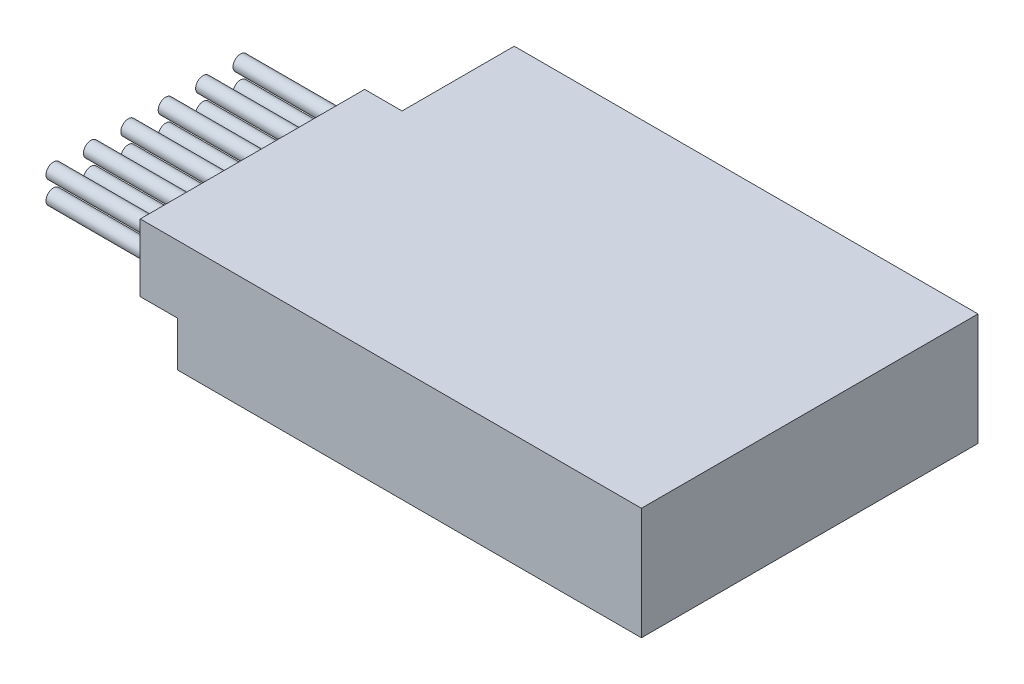
ISO-10303-21;
HEADER;
FILE_DESCRIPTION(('STEP AP214'),'2;1');
FILE_NAME('part.step','',(''),(''),'','','');
FILE_SCHEMA(('AUTOMOTIVE_DESIGN { 1 0 10303 214 1 1 1 1 }'));
ENDSEC;
DATA;
#1=APPLICATION_CONTEXT('core data for automotive mechanical design processes');
#2=APPLICATION_PROTOCOL_DEFINITION('international standard','automotive_design',2000,#1);
#3=PRODUCT_CONTEXT('',#1,'mechanical');
#4=PRODUCT('Part','Part','',(#3));
#5=PRODUCT_RELATED_PRODUCT_CATEGORY('part','',(#4));
#6=PRODUCT_DEFINITION_FORMATION('','',#4);
#7=PRODUCT_DEFINITION_CONTEXT('part definition',#1,'design');
#8=PRODUCT_DEFINITION('design','',#6,#7);
#9=PRODUCT_DEFINITION_SHAPE('','',#8);
#10=(LENGTH_UNIT() NAMED_UNIT(*) SI_UNIT(.MILLI.,.METRE.));
#11=(NAMED_UNIT(*) PLANE_ANGLE_UNIT() SI_UNIT($,.RADIAN.));
#12=(NAMED_UNIT(*) SI_UNIT($,.STERADIAN.) SOLID_ANGLE_UNIT());
#13=UNCERTAINTY_MEASURE_WITH_UNIT(LENGTH_MEASURE(1.E-05),#10,'distance_accuracy_value','');
#14=(GEOMETRIC_REPRESENTATION_CONTEXT(3) GLOBAL_UNCERTAINTY_ASSIGNED_CONTEXT((#13)) GLOBAL_UNIT_ASSIGNED_CONTEXT((#10,
#11,#12)) REPRESENTATION_CONTEXT('',''));
#15=CARTESIAN_POINT('',(0.,0.,0.));
#16=DIRECTION('',(0.,0.,1.));
#17=DIRECTION('',(1.,0.,0.));
#18=AXIS2_PLACEMENT_3D('',#15,#16,#17);
#19=CARTESIAN_POINT('',(-15.5,7.5,-11.25));
#20=DIRECTION('',(1.,0.,0.));
#21=DIRECTION('',(0.,0.,-1.));
#22=AXIS2_PLACEMENT_3D('',#19,#20,#21);
#23=PLANE('',#22);
#24=DIRECTION('',(0.,0.,1.));
#25=VECTOR('',#24,1.);
#26=CARTESIAN_POINT('',(-15.5,3.,11.25));
#27=LINE('',#26,#25);
#28=CARTESIAN_POINT('',(-15.5,3.,-3.75));
#29=VERTEX_POINT('',#28);
#30=CARTESIAN_POINT('',(-15.5,3.,11.25));
#31=VERTEX_POINT('',#30);
#32=EDGE_CURVE('E116',#29,#31,#27,.T.);
#33=ORIENTED_EDGE('',*,*,#32,.F.);
#34=DIRECTION('',(0.,-1.,0.));
#35=VECTOR('',#34,1.);
#36=CARTESIAN_POINT('',(-15.5,7.5,-3.75));
#37=LINE('',#36,#35);
#38=CARTESIAN_POINT('',(-15.5,7.5,-3.75));
#39=VERTEX_POINT('',#38);
#40=EDGE_CURVE('E46',#39,#29,#37,.T.);
#41=ORIENTED_EDGE('',*,*,#40,.F.);
#42=DIRECTION('',(0.,0.,1.));
#43=VECTOR('',#42,1.);
#44=CARTESIAN_POINT('',(-15.5,7.5,-11.25));
#45=LINE('',#44,#43);
#46=CARTESIAN_POINT('',(-15.5,7.5,-11.25));
#47=VERTEX_POINT('',#46);
#48=EDGE_CURVE('E101',#47,#39,#45,.T.);
#49=ORIENTED_EDGE('',*,*,#48,.F.);
#50=DIRECTION('',(0.,-1.,0.));
#51=VECTOR('',#50,1.);
#52=CARTESIAN_POINT('',(-15.5,7.5,-11.25));
#53=LINE('',#52,#51);
#54=CARTESIAN_POINT('',(-15.5,0.,-11.25));
#55=VERTEX_POINT('',#54);
#56=EDGE_CURVE('E232',#47,#55,#53,.T.);
#57=ORIENTED_EDGE('',*,*,#56,.T.);
#58=DIRECTION('',(0.,0.,1.));
#59=VECTOR('',#58,1.);
#60=CARTESIAN_POINT('',(-15.5,0.,-11.25));
#61=LINE('',#60,#59);
#62=CARTESIAN_POINT('',(-15.5,0.,11.25));
#63=VERTEX_POINT('',#62);
#64=EDGE_CURVE('E219',#55,#63,#61,.T.);
#65=ORIENTED_EDGE('',*,*,#64,.T.);
#66=DIRECTION('',(0.,-1.,0.));
#67=VECTOR('',#66,1.);
#68=CARTESIAN_POINT('',(-15.5,7.5,11.25));
#69=LINE('',#68,#67);
#70=EDGE_CURVE('E52',#31,#63,#69,.T.);
#71=ORIENTED_EDGE('',*,*,#70,.F.);
#72=EDGE_LOOP('',(#33,#41,#49,#57,#65,#71));
#73=FACE_BOUND('',#72,.T.);
#74=ADVANCED_FACE('F32',(#73),#23,.F.);
#75=CARTESIAN_POINT('',(15.5,7.5,11.25));
#76=DIRECTION('',(0.,0.,-1.));
#77=DIRECTION('',(-1.,0.,0.));
#78=AXIS2_PLACEMENT_3D('',#75,#76,#77);
#79=PLANE('',#78);
#80=DIRECTION('',(1.,0.,0.));
#81=VECTOR('',#80,1.);
#82=CARTESIAN_POINT('',(15.5,0.,11.25));
#83=LINE('',#82,#81);
#84=CARTESIAN_POINT('',(15.5,0.,11.25));
#85=VERTEX_POINT('',#84);
#86=EDGE_CURVE('E220',#63,#85,#83,.T.);
#87=ORIENTED_EDGE('',*,*,#86,.T.);
#88=DIRECTION('',(0.,-1.,0.));
#89=VECTOR('',#88,1.);
#90=CARTESIAN_POINT('',(15.5,7.5,11.25));
#91=LINE('',#90,#89);
#92=CARTESIAN_POINT('',(15.5,7.5,11.25));
#93=VERTEX_POINT('',#92);
#94=EDGE_CURVE('E97',#93,#85,#91,.T.);
#95=ORIENTED_EDGE('',*,*,#94,.F.);
#96=DIRECTION('',(1.,0.,0.));
#97=VECTOR('',#96,1.);
#98=CARTESIAN_POINT('',(15.5,7.5,11.25));
#99=LINE('',#98,#97);
#100=CARTESIAN_POINT('',(-18.,7.5,11.25));
#101=VERTEX_POINT('',#100);
#102=EDGE_CURVE('E90',#101,#93,#99,.T.);
#103=ORIENTED_EDGE('',*,*,#102,.F.);
#104=DIRECTION('',(0.,1.,0.));
#105=VECTOR('',#104,1.);
#106=CARTESIAN_POINT('',(-18.,7.5,11.25));
#107=LINE('',#106,#105);
#108=CARTESIAN_POINT('',(-18.,3.,11.25));
#109=VERTEX_POINT('',#108);
#110=EDGE_CURVE('E95',#109,#101,#107,.T.);
#111=ORIENTED_EDGE('',*,*,#110,.F.);
#112=DIRECTION('',(1.,0.,0.));
#113=VECTOR('',#112,1.);
#114=CARTESIAN_POINT('',(-18.,3.,11.25));
#115=LINE('',#114,#113);
#116=EDGE_CURVE('E125',#109,#31,#115,.T.);
#117=ORIENTED_EDGE('',*,*,#116,.T.);
#118=ORIENTED_EDGE('',*,*,#70,.T.);
#119=EDGE_LOOP('',(#87,#95,#103,#111,#117,#118));
#120=FACE_BOUND('',#119,.T.);
#121=ADVANCED_FACE('F92',(#120),#79,.F.);
#122=CARTESIAN_POINT('',(15.5,7.5,-11.25));
#123=DIRECTION('',(-1.,0.,0.));
#124=DIRECTION('',(0.,0.,1.));
#125=AXIS2_PLACEMENT_3D('',#122,#123,#124);
#126=PLANE('',#125);
#127=DIRECTION('',(0.,0.,-1.));
#128=VECTOR('',#127,1.);
#129=CARTESIAN_POINT('',(15.5,0.,-11.25));
#130=LINE('',#129,#128);
#131=CARTESIAN_POINT('',(15.5,0.,-11.25));
#132=VERTEX_POINT('',#131);
#133=EDGE_CURVE('E235',#85,#132,#130,.T.);
#134=ORIENTED_EDGE('',*,*,#133,.T.);
#135=DIRECTION('',(0.,-1.,0.));
#136=VECTOR('',#135,1.);
#137=CARTESIAN_POINT('',(15.5,7.5,-11.25));
#138=LINE('',#137,#136);
#139=CARTESIAN_POINT('',(15.5,7.5,-11.25));
#140=VERTEX_POINT('',#139);
#141=EDGE_CURVE('E240',#140,#132,#138,.T.);
#142=ORIENTED_EDGE('',*,*,#141,.F.);
#143=DIRECTION('',(0.,0.,-1.));
#144=VECTOR('',#143,1.);
#145=CARTESIAN_POINT('',(15.5,7.5,-11.25));
#146=LINE('',#145,#144);
#147=EDGE_CURVE('E100',#93,#140,#146,.T.);
#148=ORIENTED_EDGE('',*,*,#147,.F.);
#149=ORIENTED_EDGE('',*,*,#94,.T.);
#150=EDGE_LOOP('',(#134,#142,#148,#149));
#151=FACE_BOUND('',#150,.T.);
#152=ADVANCED_FACE('F212',(#151),#126,.F.);
#153=CARTESIAN_POINT('',(15.5,7.5,-11.25));
#154=DIRECTION('',(0.,0.,1.));
#155=DIRECTION('',(1.,0.,0.));
#156=AXIS2_PLACEMENT_3D('',#153,#154,#155);
#157=PLANE('',#156);
#158=DIRECTION('',(-1.,0.,0.));
#159=VECTOR('',#158,1.);
#160=CARTESIAN_POINT('',(15.5,0.,-11.25));
#161=LINE('',#160,#159);
#162=EDGE_CURVE('E226',#132,#55,#161,.T.);
#163=ORIENTED_EDGE('',*,*,#162,.T.);
#164=ORIENTED_EDGE('',*,*,#56,.F.);
#165=DIRECTION('',(-1.,0.,0.));
#166=VECTOR('',#165,1.);
#167=CARTESIAN_POINT('',(15.5,7.5,-11.25));
#168=LINE('',#167,#166);
#169=EDGE_CURVE('E231',#140,#47,#168,.T.);
#170=ORIENTED_EDGE('',*,*,#169,.F.);
#171=ORIENTED_EDGE('',*,*,#141,.T.);
#172=EDGE_LOOP('',(#163,#164,#170,#171));
#173=FACE_BOUND('',#172,.T.);
#174=ADVANCED_FACE('F254',(#173),#157,.F.);
#175=CARTESIAN_POINT('',(0.,7.5,0.));
#176=DIRECTION('',(0.,-1.,0.));
#177=DIRECTION('',(0.,0.,-1.));
#178=AXIS2_PLACEMENT_3D('',#175,#176,#177);
#179=PLANE('',#178);
#180=ORIENTED_EDGE('',*,*,#48,.T.);
#181=DIRECTION('',(1.,0.,0.));
#182=VECTOR('',#181,1.);
#183=CARTESIAN_POINT('',(-18.,7.5,-3.75));
#184=LINE('',#183,#182);
#185=CARTESIAN_POINT('',(-18.,7.5,-3.75));
#186=VERTEX_POINT('',#185);
#187=EDGE_CURVE('E107',#186,#39,#184,.T.);
#188=ORIENTED_EDGE('',*,*,#187,.F.);
#189=DIRECTION('',(0.,0.,-1.));
#190=VECTOR('',#189,1.);
#191=CARTESIAN_POINT('',(-18.,7.5,11.25));
#192=LINE('',#191,#190);
#193=EDGE_CURVE('E104',#101,#186,#192,.T.);
#194=ORIENTED_EDGE('',*,*,#193,.F.);
#195=ORIENTED_EDGE('',*,*,#102,.T.);
#196=ORIENTED_EDGE('',*,*,#147,.T.);
#197=ORIENTED_EDGE('',*,*,#169,.T.);
#198=EDGE_LOOP('',(#180,#188,#194,#195,#196,#197));
#199=FACE_BOUND('',#198,.T.);
#200=ADVANCED_FACE('F105',(#199),#179,.F.);
#201=CARTESIAN_POINT('',(0.,0.,0.));
#202=DIRECTION('',(0.,-1.,0.));
#203=DIRECTION('',(0.,0.,-1.));
#204=AXIS2_PLACEMENT_3D('',#201,#202,#203);
#205=PLANE('',#204);
#206=ORIENTED_EDGE('',*,*,#64,.F.);
#207=ORIENTED_EDGE('',*,*,#162,.F.);
#208=ORIENTED_EDGE('',*,*,#133,.F.);
#209=ORIENTED_EDGE('',*,*,#86,.F.);
#210=EDGE_LOOP('',(#206,#207,#208,#209));
#211=FACE_BOUND('',#210,.T.);
#212=ADVANCED_FACE('F249',(#211),#205,.T.);
#213=CARTESIAN_POINT('',(-18.,7.5,-3.75));
#214=DIRECTION('',(0.,0.,1.));
#215=DIRECTION('',(0.,-1.,0.));
#216=AXIS2_PLACEMENT_3D('',#213,#214,#215);
#217=PLANE('',#216);
#218=ORIENTED_EDGE('',*,*,#40,.T.);
#219=DIRECTION('',(1.,0.,0.));
#220=VECTOR('',#219,1.);
#221=CARTESIAN_POINT('',(-18.,3.,-3.75));
#222=LINE('',#221,#220);
#223=CARTESIAN_POINT('',(-18.,3.,-3.75));
#224=VERTEX_POINT('',#223);
#225=EDGE_CURVE('E128',#224,#29,#222,.T.);
#226=ORIENTED_EDGE('',*,*,#225,.F.);
#227=DIRECTION('',(0.,-1.,0.));
#228=VECTOR('',#227,1.);
#229=CARTESIAN_POINT('',(-18.,7.5,-3.75));
#230=LINE('',#229,#228);
#231=EDGE_CURVE('E110',#186,#224,#230,.T.);
#232=ORIENTED_EDGE('',*,*,#231,.F.);
#233=ORIENTED_EDGE('',*,*,#187,.T.);
#234=EDGE_LOOP('',(#218,#226,#232,#233));
#235=FACE_BOUND('',#234,.T.);
#236=ADVANCED_FACE('F217',(#235),#217,.F.);
#237=CARTESIAN_POINT('',(-18.,3.,11.25));
#238=DIRECTION('',(0.,1.,0.));
#239=DIRECTION('',(0.,0.,1.));
#240=AXIS2_PLACEMENT_3D('',#237,#238,#239);
#241=PLANE('',#240);
#242=ORIENTED_EDGE('',*,*,#32,.T.);
#243=ORIENTED_EDGE('',*,*,#116,.F.);
#244=DIRECTION('',(0.,0.,1.));
#245=VECTOR('',#244,1.);
#246=CARTESIAN_POINT('',(-18.,3.,11.25));
#247=LINE('',#246,#245);
#248=EDGE_CURVE('E114',#224,#109,#247,.T.);
#249=ORIENTED_EDGE('',*,*,#248,.F.);
#250=ORIENTED_EDGE('',*,*,#225,.T.);
#251=EDGE_LOOP('',(#242,#243,#249,#250));
#252=FACE_BOUND('',#251,.T.);
#253=ADVANCED_FACE('F174',(#252),#241,.F.);
#254=CARTESIAN_POINT('',(-18.,0.,0.));
#255=DIRECTION('',(1.,0.,0.));
#256=DIRECTION('',(0.,0.,-1.));
#257=AXIS2_PLACEMENT_3D('',#254,#255,#256);
#258=PLANE('',#257);
#259=CARTESIAN_POINT('',(-18.,4.7,10.05));
#260=DIRECTION('',(1.,0.,0.));
#261=DIRECTION('',(0.,0.,-1.));
#262=AXIS2_PLACEMENT_3D('',#259,#260,#261);
#263=CIRCLE('',#262,0.500000000000001);
#264=CARTESIAN_POINT('',(-18.,4.7,9.55000000000001));
#265=VERTEX_POINT('',#264);
#266=EDGE_CURVE('E11',#265,#265,#263,.F.);
#267=ORIENTED_EDGE('',*,*,#266,.F.);
#268=EDGE_LOOP('',(#267));
#269=FACE_BOUND('',#268,.T.);
#270=CARTESIAN_POINT('',(-18.,4.7,7.55000000000001));
#271=DIRECTION('',(1.,0.,0.));
#272=DIRECTION('',(0.,0.,-1.));
#273=AXIS2_PLACEMENT_3D('',#270,#271,#272);
#274=CIRCLE('',#273,0.500000000000001);
#275=CARTESIAN_POINT('',(-18.,4.7,7.05000000000001));
#276=VERTEX_POINT('',#275);
#277=EDGE_CURVE('E39',#276,#276,#274,.F.);
#278=ORIENTED_EDGE('',*,*,#277,.F.);
#279=EDGE_LOOP('',(#278));
#280=FACE_BOUND('',#279,.T.);
#281=CARTESIAN_POINT('',(-18.,4.7,5.05000000000001));
#282=DIRECTION('',(1.,0.,0.));
#283=DIRECTION('',(0.,0.,-1.));
#284=AXIS2_PLACEMENT_3D('',#281,#282,#283);
#285=CIRCLE('',#284,0.500000000000001);
#286=CARTESIAN_POINT('',(-18.,4.7,4.55000000000001));
#287=VERTEX_POINT('',#286);
#288=EDGE_CURVE('E164',#287,#287,#285,.F.);
#289=ORIENTED_EDGE('',*,*,#288,.F.);
#290=EDGE_LOOP('',(#289));
#291=FACE_BOUND('',#290,.T.);
#292=CARTESIAN_POINT('',(-18.,4.7,2.55000000000002));
#293=DIRECTION('',(1.,0.,0.));
#294=DIRECTION('',(0.,0.,-1.));
#295=AXIS2_PLACEMENT_3D('',#292,#293,#294);
#296=CIRCLE('',#295,0.5);
#297=CARTESIAN_POINT('',(-18.,4.7,2.05000000000002));
#298=VERTEX_POINT('',#297);
#299=EDGE_CURVE('E161',#298,#298,#296,.F.);
#300=ORIENTED_EDGE('',*,*,#299,.F.);
#301=EDGE_LOOP('',(#300));
#302=FACE_BOUND('',#301,.T.);
#303=CARTESIAN_POINT('',(-18.,4.7,0.0500000000000153));
#304=DIRECTION('',(1.,0.,0.));
#305=DIRECTION('',(0.,0.,-1.));
#306=AXIS2_PLACEMENT_3D('',#303,#304,#305);
#307=CIRCLE('',#306,0.5);
#308=CARTESIAN_POINT('',(-18.,4.7,-0.449999999999985));
#309=VERTEX_POINT('',#308);
#310=EDGE_CURVE('E158',#309,#309,#307,.F.);
#311=ORIENTED_EDGE('',*,*,#310,.F.);
#312=EDGE_LOOP('',(#311));
#313=FACE_BOUND('',#312,.T.);
#314=CARTESIAN_POINT('',(-18.,4.7,-2.44999999999998));
#315=DIRECTION('',(1.,0.,0.));
#316=DIRECTION('',(0.,0.,-1.));
#317=AXIS2_PLACEMENT_3D('',#314,#315,#316);
#318=CIRCLE('',#317,0.5);
#319=CARTESIAN_POINT('',(-18.,4.7,-2.94999999999998));
#320=VERTEX_POINT('',#319);
#321=EDGE_CURVE('E155',#320,#320,#318,.F.);
#322=ORIENTED_EDGE('',*,*,#321,.F.);
#323=EDGE_LOOP('',(#322));
#324=FACE_BOUND('',#323,.T.);
#325=CARTESIAN_POINT('',(-18.,6.2,10.05));
#326=DIRECTION('',(1.,0.,0.));
#327=DIRECTION('',(0.,0.,-1.));
#328=AXIS2_PLACEMENT_3D('',#325,#326,#327);
#329=CIRCLE('',#328,0.500000000000001);
#330=CARTESIAN_POINT('',(-18.,6.2,9.55));
#331=VERTEX_POINT('',#330);
#332=EDGE_CURVE('E152',#331,#331,#329,.F.);
#333=ORIENTED_EDGE('',*,*,#332,.F.);
#334=EDGE_LOOP('',(#333));
#335=FACE_BOUND('',#334,.T.);
#336=CARTESIAN_POINT('',(-18.,6.2,7.55));
#337=DIRECTION('',(1.,0.,0.));
#338=DIRECTION('',(0.,0.,-1.));
#339=AXIS2_PLACEMENT_3D('',#336,#337,#338);
#340=CIRCLE('',#339,0.500000000000001);
#341=CARTESIAN_POINT('',(-18.,6.2,7.05));
#342=VERTEX_POINT('',#341);
#343=EDGE_CURVE('E149',#342,#342,#340,.F.);
#344=ORIENTED_EDGE('',*,*,#343,.F.);
#345=EDGE_LOOP('',(#344));
#346=FACE_BOUND('',#345,.T.);
#347=CARTESIAN_POINT('',(-18.,6.2,5.05));
#348=DIRECTION('',(1.,0.,0.));
#349=DIRECTION('',(0.,0.,-1.));
#350=AXIS2_PLACEMENT_3D('',#347,#348,#349);
#351=CIRCLE('',#350,0.500000000000001);
#352=CARTESIAN_POINT('',(-18.,6.2,4.55));
#353=VERTEX_POINT('',#352);
#354=EDGE_CURVE('E146',#353,#353,#351,.F.);
#355=ORIENTED_EDGE('',*,*,#354,.F.);
#356=EDGE_LOOP('',(#355));
#357=FACE_BOUND('',#356,.T.);
#358=CARTESIAN_POINT('',(-18.,6.2,2.55));
#359=DIRECTION('',(1.,0.,0.));
#360=DIRECTION('',(0.,0.,-1.));
#361=AXIS2_PLACEMENT_3D('',#358,#359,#360);
#362=CIRCLE('',#361,0.5);
#363=CARTESIAN_POINT('',(-18.,6.2,2.05));
#364=VERTEX_POINT('',#363);
#365=EDGE_CURVE('E143',#364,#364,#362,.F.);
#366=ORIENTED_EDGE('',*,*,#365,.F.);
#367=EDGE_LOOP('',(#366));
#368=FACE_BOUND('',#367,.T.);
#369=CARTESIAN_POINT('',(-18.,6.2,0.0499999999999996));
#370=DIRECTION('',(1.,0.,0.));
#371=DIRECTION('',(0.,0.,-1.));
#372=AXIS2_PLACEMENT_3D('',#369,#370,#371);
#373=CIRCLE('',#372,0.5);
#374=CARTESIAN_POINT('',(-18.,6.2,-0.450000000000001));
#375=VERTEX_POINT('',#374);
#376=EDGE_CURVE('E140',#375,#375,#373,.F.);
#377=ORIENTED_EDGE('',*,*,#376,.F.);
#378=EDGE_LOOP('',(#377));
#379=FACE_BOUND('',#378,.T.);
#380=CARTESIAN_POINT('',(-18.,6.2,-2.45));
#381=DIRECTION('',(1.,0.,0.));
#382=DIRECTION('',(0.,0.,-1.));
#383=AXIS2_PLACEMENT_3D('',#380,#381,#382);
#384=CIRCLE('',#383,0.5);
#385=CARTESIAN_POINT('',(-18.,6.2,-2.95));
#386=VERTEX_POINT('',#385);
#387=EDGE_CURVE('E137',#386,#386,#384,.F.);
#388=ORIENTED_EDGE('',*,*,#387,.F.);
#389=EDGE_LOOP('',(#388));
#390=FACE_BOUND('',#389,.T.);
#391=ORIENTED_EDGE('',*,*,#110,.T.);
#392=ORIENTED_EDGE('',*,*,#193,.T.);
#393=ORIENTED_EDGE('',*,*,#231,.T.);
#394=ORIENTED_EDGE('',*,*,#248,.T.);
#395=EDGE_LOOP('',(#391,#392,#393,#394));
#396=FACE_BOUND('',#395,.T.);
#397=ADVANCED_FACE('F112',(#269,#280,#291,#302,#313,#324,#335,#346,#357,#368,#379,#390,#396),
#258,.F.);
#398=CARTESIAN_POINT('',(-25.,6.2,-2.45));
#399=DIRECTION('',(1.,0.,0.));
#400=DIRECTION('',(0.,0.,-1.));
#401=AXIS2_PLACEMENT_3D('',#398,#399,#400);
#402=CYLINDRICAL_SURFACE('',#401,0.5);
#403=CARTESIAN_POINT('',(-25.,6.2,-2.45));
#404=DIRECTION('',(-1.,0.,0.));
#405=DIRECTION('',(0.,0.,1.));
#406=AXIS2_PLACEMENT_3D('',#403,#404,#405);
#407=CIRCLE('',#406,0.5);
#408=CARTESIAN_POINT('',(-25.,6.2,-1.95));
#409=VERTEX_POINT('',#408);
#410=EDGE_CURVE('E120',#409,#409,#407,.T.);
#411=ORIENTED_EDGE('',*,*,#410,.F.);
#412=EDGE_LOOP('',(#411));
#413=FACE_BOUND('',#412,.T.);
#414=ORIENTED_EDGE('',*,*,#387,.T.);
#415=EDGE_LOOP('',(#414));
#416=FACE_BOUND('',#415,.T.);
#417=ADVANCED_FACE('F173',(#413,#416),#402,.T.);
#418=CARTESIAN_POINT('',(-25.,6.2,-2.45));
#419=DIRECTION('',(-1.,0.,0.));
#420=DIRECTION('',(0.,0.,1.));
#421=AXIS2_PLACEMENT_3D('',#418,#419,#420);
#422=PLANE('',#421);
#423=ORIENTED_EDGE('',*,*,#410,.T.);
#424=EDGE_LOOP('',(#423));
#425=FACE_BOUND('',#424,.T.);
#426=ADVANCED_FACE('F198',(#425),#422,.T.);
#427=CARTESIAN_POINT('',(-25.,6.2,0.0500000000000004));
#428=DIRECTION('',(1.,0.,0.));
#429=DIRECTION('',(0.,0.,-1.));
#430=AXIS2_PLACEMENT_3D('',#427,#428,#429);
#431=CYLINDRICAL_SURFACE('',#430,0.5);
#432=CARTESIAN_POINT('',(-25.,6.2,0.0500000000000004));
#433=DIRECTION('',(-1.,0.,0.));
#434=DIRECTION('',(0.,0.,1.));
#435=AXIS2_PLACEMENT_3D('',#432,#433,#434);
#436=CIRCLE('',#435,0.5);
#437=CARTESIAN_POINT('',(-25.,6.2,0.550000000000001));
#438=VERTEX_POINT('',#437);
#439=EDGE_CURVE('E541',#438,#438,#436,.T.);
#440=ORIENTED_EDGE('',*,*,#439,.F.);
#441=EDGE_LOOP('',(#440));
#442=FACE_BOUND('',#441,.T.);
#443=ORIENTED_EDGE('',*,*,#376,.T.);
#444=EDGE_LOOP('',(#443));
#445=FACE_BOUND('',#444,.T.);
#446=ADVANCED_FACE('F204',(#442,#445),#431,.T.);
#447=CARTESIAN_POINT('',(-25.,6.2,0.0500000000000004));
#448=DIRECTION('',(-1.,0.,0.));
#449=DIRECTION('',(0.,0.,1.));
#450=AXIS2_PLACEMENT_3D('',#447,#448,#449);
#451=PLANE('',#450);
#452=ORIENTED_EDGE('',*,*,#439,.T.);
#453=EDGE_LOOP('',(#452));
#454=FACE_BOUND('',#453,.T.);
#455=ADVANCED_FACE('F297',(#454),#451,.T.);
#456=CARTESIAN_POINT('',(-25.,6.2,2.55));
#457=DIRECTION('',(1.,0.,0.));
#458=DIRECTION('',(0.,0.,-1.));
#459=AXIS2_PLACEMENT_3D('',#456,#457,#458);
#460=CYLINDRICAL_SURFACE('',#459,0.5);
#461=CARTESIAN_POINT('',(-25.,6.2,2.55));
#462=DIRECTION('',(-1.,0.,0.));
#463=DIRECTION('',(0.,0.,1.));
#464=AXIS2_PLACEMENT_3D('',#461,#462,#463);
#465=CIRCLE('',#464,0.5);
#466=CARTESIAN_POINT('',(-25.,6.2,3.05));
#467=VERTEX_POINT('',#466);
#468=EDGE_CURVE('E539',#467,#467,#465,.T.);
#469=ORIENTED_EDGE('',*,*,#468,.F.);
#470=EDGE_LOOP('',(#469));
#471=FACE_BOUND('',#470,.T.);
#472=ORIENTED_EDGE('',*,*,#365,.T.);
#473=EDGE_LOOP('',(#472));
#474=FACE_BOUND('',#473,.T.);
#475=ADVANCED_FACE('F307',(#471,#474),#460,.T.);
#476=CARTESIAN_POINT('',(-25.,6.2,2.55));
#477=DIRECTION('',(-1.,0.,0.));
#478=DIRECTION('',(0.,0.,1.));
#479=AXIS2_PLACEMENT_3D('',#476,#477,#478);
#480=PLANE('',#479);
#481=ORIENTED_EDGE('',*,*,#468,.T.);
#482=EDGE_LOOP('',(#481));
#483=FACE_BOUND('',#482,.T.);
#484=ADVANCED_FACE('F317',(#483),#480,.T.);
#485=CARTESIAN_POINT('',(-25.,6.2,5.05));
#486=DIRECTION('',(1.,0.,0.));
#487=DIRECTION('',(0.,0.,-1.));
#488=AXIS2_PLACEMENT_3D('',#485,#486,#487);
#489=CYLINDRICAL_SURFACE('',#488,0.500000000000001);
#490=CARTESIAN_POINT('',(-25.,6.2,5.05));
#491=DIRECTION('',(-1.,0.,0.));
#492=DIRECTION('',(0.,0.,1.));
#493=AXIS2_PLACEMENT_3D('',#490,#491,#492);
#494=CIRCLE('',#493,0.500000000000001);
#495=CARTESIAN_POINT('',(-25.,6.2,5.55));
#496=VERTEX_POINT('',#495);
#497=EDGE_CURVE('E536',#496,#496,#494,.T.);
#498=ORIENTED_EDGE('',*,*,#497,.F.);
#499=EDGE_LOOP('',(#498));
#500=FACE_BOUND('',#499,.T.);
#501=ORIENTED_EDGE('',*,*,#354,.T.);
#502=EDGE_LOOP('',(#501));
#503=FACE_BOUND('',#502,.T.);
#504=ADVANCED_FACE('F327',(#500,#503),#489,.T.);
#505=CARTESIAN_POINT('',(-25.,6.2,5.05));
#506=DIRECTION('',(-1.,0.,0.));
#507=DIRECTION('',(0.,0.,1.));
#508=AXIS2_PLACEMENT_3D('',#505,#506,#507);
#509=PLANE('',#508);
#510=ORIENTED_EDGE('',*,*,#497,.T.);
#511=EDGE_LOOP('',(#510));
#512=FACE_BOUND('',#511,.T.);
#513=ADVANCED_FACE('F337',(#512),#509,.T.);
#514=CARTESIAN_POINT('',(-25.,6.2,7.55));
#515=DIRECTION('',(1.,0.,0.));
#516=DIRECTION('',(0.,0.,-1.));
#517=AXIS2_PLACEMENT_3D('',#514,#515,#516);
#518=CYLINDRICAL_SURFACE('',#517,0.500000000000001);
#519=CARTESIAN_POINT('',(-25.,6.2,7.55));
#520=DIRECTION('',(-1.,0.,0.));
#521=DIRECTION('',(0.,0.,1.));
#522=AXIS2_PLACEMENT_3D('',#519,#520,#521);
#523=CIRCLE('',#522,0.500000000000001);
#524=CARTESIAN_POINT('',(-25.,6.2,8.05));
#525=VERTEX_POINT('',#524);
#526=EDGE_CURVE('E533',#525,#525,#523,.T.);
#527=ORIENTED_EDGE('',*,*,#526,.F.);
#528=EDGE_LOOP('',(#527));
#529=FACE_BOUND('',#528,.T.);
#530=ORIENTED_EDGE('',*,*,#343,.T.);
#531=EDGE_LOOP('',(#530));
#532=FACE_BOUND('',#531,.T.);
#533=ADVANCED_FACE('F347',(#529,#532),#518,.T.);
#534=CARTESIAN_POINT('',(-25.,6.2,7.55));
#535=DIRECTION('',(-1.,0.,0.));
#536=DIRECTION('',(0.,0.,1.));
#537=AXIS2_PLACEMENT_3D('',#534,#535,#536);
#538=PLANE('',#537);
#539=ORIENTED_EDGE('',*,*,#526,.T.);
#540=EDGE_LOOP('',(#539));
#541=FACE_BOUND('',#540,.T.);
#542=ADVANCED_FACE('F357',(#541),#538,.T.);
#543=CARTESIAN_POINT('',(-25.,6.2,10.05));
#544=DIRECTION('',(1.,0.,0.));
#545=DIRECTION('',(0.,0.,-1.));
#546=AXIS2_PLACEMENT_3D('',#543,#544,#545);
#547=CYLINDRICAL_SURFACE('',#546,0.500000000000001);
#548=CARTESIAN_POINT('',(-25.,6.2,10.05));
#549=DIRECTION('',(-1.,0.,0.));
#550=DIRECTION('',(0.,0.,1.));
#551=AXIS2_PLACEMENT_3D('',#548,#549,#550);
#552=CIRCLE('',#551,0.500000000000001);
#553=CARTESIAN_POINT('',(-25.,6.2,10.55));
#554=VERTEX_POINT('',#553);
#555=EDGE_CURVE('E530',#554,#554,#552,.T.);
#556=ORIENTED_EDGE('',*,*,#555,.F.);
#557=EDGE_LOOP('',(#556));
#558=FACE_BOUND('',#557,.T.);
#559=ORIENTED_EDGE('',*,*,#332,.T.);
#560=EDGE_LOOP('',(#559));
#561=FACE_BOUND('',#560,.T.);
#562=ADVANCED_FACE('F367',(#558,#561),#547,.T.);
#563=CARTESIAN_POINT('',(-25.,6.2,10.05));
#564=DIRECTION('',(-1.,0.,0.));
#565=DIRECTION('',(0.,0.,1.));
#566=AXIS2_PLACEMENT_3D('',#563,#564,#565);
#567=PLANE('',#566);
#568=ORIENTED_EDGE('',*,*,#555,.T.);
#569=EDGE_LOOP('',(#568));
#570=FACE_BOUND('',#569,.T.);
#571=ADVANCED_FACE('F377',(#570),#567,.T.);
#572=CARTESIAN_POINT('',(-25.,4.7,-2.44999999999998));
#573=DIRECTION('',(1.,0.,0.));
#574=DIRECTION('',(0.,0.,-1.));
#575=AXIS2_PLACEMENT_3D('',#572,#573,#574);
#576=CYLINDRICAL_SURFACE('',#575,0.5);
#577=CARTESIAN_POINT('',(-25.,4.7,-2.44999999999998));
#578=DIRECTION('',(-1.,0.,0.));
#579=DIRECTION('',(0.,0.,1.));
#580=AXIS2_PLACEMENT_3D('',#577,#578,#579);
#581=CIRCLE('',#580,0.5);
#582=CARTESIAN_POINT('',(-25.,4.7,-1.94999999999998));
#583=VERTEX_POINT('',#582);
#584=EDGE_CURVE('E527',#583,#583,#581,.T.);
#585=ORIENTED_EDGE('',*,*,#584,.F.);
#586=EDGE_LOOP('',(#585));
#587=FACE_BOUND('',#586,.T.);
#588=ORIENTED_EDGE('',*,*,#321,.T.);
#589=EDGE_LOOP('',(#588));
#590=FACE_BOUND('',#589,.T.);
#591=ADVANCED_FACE('F387',(#587,#590),#576,.T.);
#592=CARTESIAN_POINT('',(-25.,4.7,-2.44999999999998));
#593=DIRECTION('',(-1.,0.,0.));
#594=DIRECTION('',(0.,0.,1.));
#595=AXIS2_PLACEMENT_3D('',#592,#593,#594);
#596=PLANE('',#595);
#597=ORIENTED_EDGE('',*,*,#584,.T.);
#598=EDGE_LOOP('',(#597));
#599=FACE_BOUND('',#598,.T.);
#600=ADVANCED_FACE('F397',(#599),#596,.T.);
#601=CARTESIAN_POINT('',(-25.,4.7,0.0500000000000161));
#602=DIRECTION('',(1.,0.,0.));
#603=DIRECTION('',(0.,0.,-1.));
#604=AXIS2_PLACEMENT_3D('',#601,#602,#603);
#605=CYLINDRICAL_SURFACE('',#604,0.5);
#606=CARTESIAN_POINT('',(-25.,4.7,0.0500000000000161));
#607=DIRECTION('',(-1.,0.,0.));
#608=DIRECTION('',(0.,0.,1.));
#609=AXIS2_PLACEMENT_3D('',#606,#607,#608);
#610=CIRCLE('',#609,0.5);
#611=CARTESIAN_POINT('',(-25.,4.7,0.550000000000016));
#612=VERTEX_POINT('',#611);
#613=EDGE_CURVE('E524',#612,#612,#610,.T.);
#614=ORIENTED_EDGE('',*,*,#613,.F.);
#615=EDGE_LOOP('',(#614));
#616=FACE_BOUND('',#615,.T.);
#617=ORIENTED_EDGE('',*,*,#310,.T.);
#618=EDGE_LOOP('',(#617));
#619=FACE_BOUND('',#618,.T.);
#620=ADVANCED_FACE('F407',(#616,#619),#605,.T.);
#621=CARTESIAN_POINT('',(-25.,4.7,0.0500000000000161));
#622=DIRECTION('',(-1.,0.,0.));
#623=DIRECTION('',(0.,0.,1.));
#624=AXIS2_PLACEMENT_3D('',#621,#622,#623);
#625=PLANE('',#624);
#626=ORIENTED_EDGE('',*,*,#613,.T.);
#627=EDGE_LOOP('',(#626));
#628=FACE_BOUND('',#627,.T.);
#629=ADVANCED_FACE('F417',(#628),#625,.T.);
#630=CARTESIAN_POINT('',(-25.,4.7,2.55000000000002));
#631=DIRECTION('',(1.,0.,0.));
#632=DIRECTION('',(0.,0.,-1.));
#633=AXIS2_PLACEMENT_3D('',#630,#631,#632);
#634=CYLINDRICAL_SURFACE('',#633,0.5);
#635=CARTESIAN_POINT('',(-25.,4.7,2.55000000000002));
#636=DIRECTION('',(-1.,0.,0.));
#637=DIRECTION('',(0.,0.,1.));
#638=AXIS2_PLACEMENT_3D('',#635,#636,#637);
#639=CIRCLE('',#638,0.5);
#640=CARTESIAN_POINT('',(-25.,4.7,3.05000000000002));
#641=VERTEX_POINT('',#640);
#642=EDGE_CURVE('E521',#641,#641,#639,.T.);
#643=ORIENTED_EDGE('',*,*,#642,.F.);
#644=EDGE_LOOP('',(#643));
#645=FACE_BOUND('',#644,.T.);
#646=ORIENTED_EDGE('',*,*,#299,.T.);
#647=EDGE_LOOP('',(#646));
#648=FACE_BOUND('',#647,.T.);
#649=ADVANCED_FACE('F427',(#645,#648),#634,.T.);
#650=CARTESIAN_POINT('',(-25.,4.7,2.55000000000002));
#651=DIRECTION('',(-1.,0.,0.));
#652=DIRECTION('',(0.,0.,1.));
#653=AXIS2_PLACEMENT_3D('',#650,#651,#652);
#654=PLANE('',#653);
#655=ORIENTED_EDGE('',*,*,#642,.T.);
#656=EDGE_LOOP('',(#655));
#657=FACE_BOUND('',#656,.T.);
#658=ADVANCED_FACE('F437',(#657),#654,.T.);
#659=CARTESIAN_POINT('',(-25.,4.7,5.05000000000002));
#660=DIRECTION('',(1.,0.,0.));
#661=DIRECTION('',(0.,0.,-1.));
#662=AXIS2_PLACEMENT_3D('',#659,#660,#661);
#663=CYLINDRICAL_SURFACE('',#662,0.500000000000001);
#664=CARTESIAN_POINT('',(-25.,4.7,5.05000000000002));
#665=DIRECTION('',(-1.,0.,0.));
#666=DIRECTION('',(0.,0.,1.));
#667=AXIS2_PLACEMENT_3D('',#664,#665,#666);
#668=CIRCLE('',#667,0.500000000000001);
#669=CARTESIAN_POINT('',(-25.,4.7,5.55000000000002));
#670=VERTEX_POINT('',#669);
#671=EDGE_CURVE('E516',#670,#670,#668,.T.);
#672=ORIENTED_EDGE('',*,*,#671,.F.);
#673=EDGE_LOOP('',(#672));
#674=FACE_BOUND('',#673,.T.);
#675=ORIENTED_EDGE('',*,*,#288,.T.);
#676=EDGE_LOOP('',(#675));
#677=FACE_BOUND('',#676,.T.);
#678=ADVANCED_FACE('F447',(#674,#677),#663,.T.);
#679=CARTESIAN_POINT('',(-25.,4.7,5.05000000000002));
#680=DIRECTION('',(-1.,0.,0.));
#681=DIRECTION('',(0.,0.,1.));
#682=AXIS2_PLACEMENT_3D('',#679,#680,#681);
#683=PLANE('',#682);
#684=ORIENTED_EDGE('',*,*,#671,.T.);
#685=EDGE_LOOP('',(#684));
#686=FACE_BOUND('',#685,.T.);
#687=ADVANCED_FACE('F457',(#686),#683,.T.);
#688=CARTESIAN_POINT('',(-25.,4.7,7.55000000000002));
#689=DIRECTION('',(1.,0.,0.));
#690=DIRECTION('',(0.,0.,-1.));
#691=AXIS2_PLACEMENT_3D('',#688,#689,#690);
#692=CYLINDRICAL_SURFACE('',#691,0.500000000000001);
#693=CARTESIAN_POINT('',(-25.,4.7,7.55000000000002));
#694=DIRECTION('',(-1.,0.,0.));
#695=DIRECTION('',(0.,0.,1.));
#696=AXIS2_PLACEMENT_3D('',#693,#694,#695);
#697=CIRCLE('',#696,0.500000000000001);
#698=CARTESIAN_POINT('',(-25.,4.7,8.05000000000002));
#699=VERTEX_POINT('',#698);
#700=EDGE_CURVE('E513',#699,#699,#697,.T.);
#701=ORIENTED_EDGE('',*,*,#700,.F.);
#702=EDGE_LOOP('',(#701));
#703=FACE_BOUND('',#702,.T.);
#704=ORIENTED_EDGE('',*,*,#277,.T.);
#705=EDGE_LOOP('',(#704));
#706=FACE_BOUND('',#705,.T.);
#707=ADVANCED_FACE('F169',(#703,#706),#692,.T.);
#708=CARTESIAN_POINT('',(-25.,4.7,7.55000000000002));
#709=DIRECTION('',(-1.,0.,0.));
#710=DIRECTION('',(0.,0.,1.));
#711=AXIS2_PLACEMENT_3D('',#708,#709,#710);
#712=PLANE('',#711);
#713=ORIENTED_EDGE('',*,*,#700,.T.);
#714=EDGE_LOOP('',(#713));
#715=FACE_BOUND('',#714,.T.);
#716=ADVANCED_FACE('F476',(#715),#712,.T.);
#717=CARTESIAN_POINT('',(-25.,4.7,10.05));
#718=DIRECTION('',(1.,0.,0.));
#719=DIRECTION('',(0.,0.,-1.));
#720=AXIS2_PLACEMENT_3D('',#717,#718,#719);
#721=CYLINDRICAL_SURFACE('',#720,0.500000000000001);
#722=CARTESIAN_POINT('',(-25.,4.7,10.05));
#723=DIRECTION('',(-1.,0.,0.));
#724=DIRECTION('',(0.,0.,1.));
#725=AXIS2_PLACEMENT_3D('',#722,#723,#724);
#726=CIRCLE('',#725,0.500000000000001);
#727=CARTESIAN_POINT('',(-25.,4.7,10.55));
#728=VERTEX_POINT('',#727);
#729=EDGE_CURVE('E512',#728,#728,#726,.T.);
#730=ORIENTED_EDGE('',*,*,#729,.F.);
#731=EDGE_LOOP('',(#730));
#732=FACE_BOUND('',#731,.T.);
#733=ORIENTED_EDGE('',*,*,#266,.T.);
#734=EDGE_LOOP('',(#733));
#735=FACE_BOUND('',#734,.T.);
#736=ADVANCED_FACE('F486',(#732,#735),#721,.T.);
#737=CARTESIAN_POINT('',(-25.,4.7,10.05));
#738=DIRECTION('',(-1.,0.,0.));
#739=DIRECTION('',(0.,0.,1.));
#740=AXIS2_PLACEMENT_3D('',#737,#738,#739);
#741=PLANE('',#740);
#742=ORIENTED_EDGE('',*,*,#729,.T.);
#743=EDGE_LOOP('',(#742));
#744=FACE_BOUND('',#743,.T.);
#745=ADVANCED_FACE('F496',(#744),#741,.T.);
#746=CLOSED_SHELL('',(#74,#121,#152,#174,#200,#212,#236,#253,#397,#417,#426,#446,#455,#475,#484,
#504,#513,#533,#542,#562,#571,#591,#600,#620,#629,#649,#658,#678,#687,#707,#716,#736,#745));
#747=MANIFOLD_SOLID_BREP('B2',#746);
#748=ADVANCED_BREP_SHAPE_REPRESENTATION('',(#18,#747),#14);
#749=SHAPE_DEFINITION_REPRESENTATION(#9,#748);
ENDSEC;
END-ISO-10303-21;
